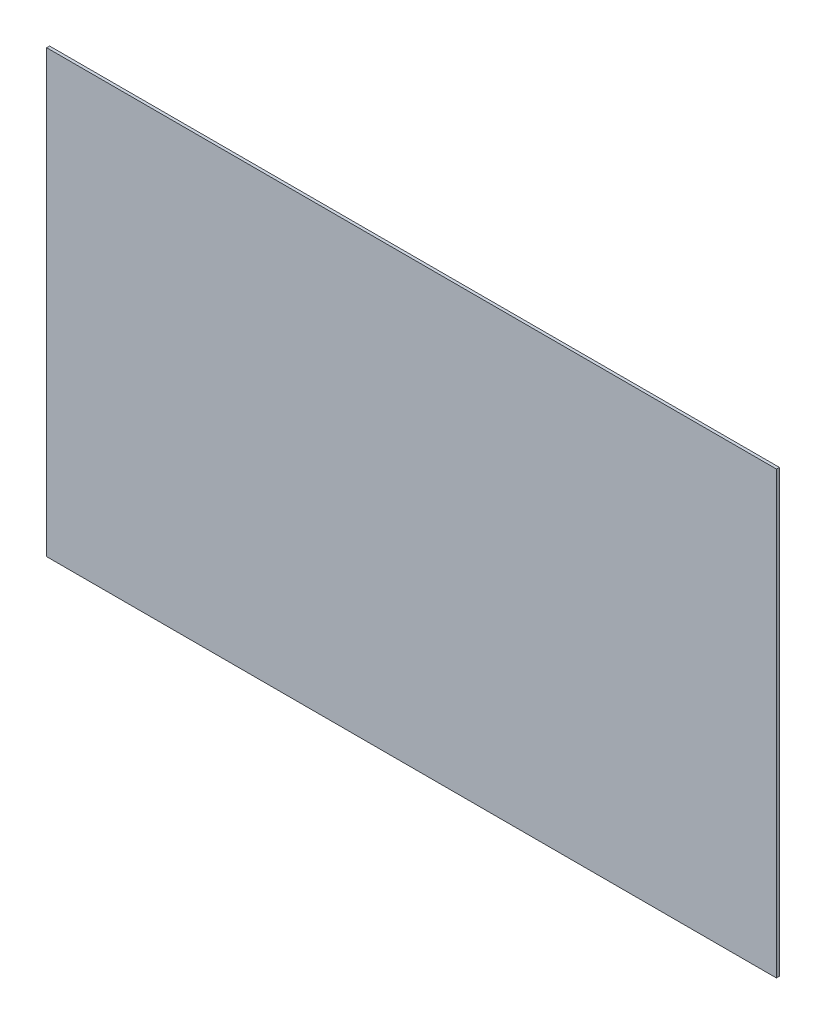
ISO-10303-21;
HEADER;
FILE_DESCRIPTION(('STEP AP214'),'2;1');
FILE_NAME('part.step','',(''),(''),'','','');
FILE_SCHEMA(('AUTOMOTIVE_DESIGN { 1 0 10303 214 1 1 1 1 }'));
ENDSEC;
DATA;
#1=APPLICATION_CONTEXT('core data for automotive mechanical design processes');
#2=APPLICATION_PROTOCOL_DEFINITION('international standard','automotive_design',2000,#1);
#3=PRODUCT_CONTEXT('',#1,'mechanical');
#4=PRODUCT('Part','Part','',(#3));
#5=PRODUCT_RELATED_PRODUCT_CATEGORY('part','',(#4));
#6=PRODUCT_DEFINITION_FORMATION('','',#4);
#7=PRODUCT_DEFINITION_CONTEXT('part definition',#1,'design');
#8=PRODUCT_DEFINITION('design','',#6,#7);
#9=PRODUCT_DEFINITION_SHAPE('','',#8);
#10=(LENGTH_UNIT() NAMED_UNIT(*) SI_UNIT(.MILLI.,.METRE.));
#11=(NAMED_UNIT(*) PLANE_ANGLE_UNIT() SI_UNIT($,.RADIAN.));
#12=(NAMED_UNIT(*) SI_UNIT($,.STERADIAN.) SOLID_ANGLE_UNIT());
#13=UNCERTAINTY_MEASURE_WITH_UNIT(LENGTH_MEASURE(1.E-05),#10,'distance_accuracy_value','');
#14=(GEOMETRIC_REPRESENTATION_CONTEXT(3) GLOBAL_UNCERTAINTY_ASSIGNED_CONTEXT((#13)) GLOBAL_UNIT_ASSIGNED_CONTEXT((#10,
#11,#12)) REPRESENTATION_CONTEXT('',''));
#15=CARTESIAN_POINT('',(0.,0.,0.));
#16=DIRECTION('',(0.,0.,1.));
#17=DIRECTION('',(1.,0.,0.));
#18=AXIS2_PLACEMENT_3D('',#15,#16,#17);
#19=CARTESIAN_POINT('',(2500.,1510.,10.));
#20=DIRECTION('',(0.,-1.,0.));
#21=DIRECTION('',(1.,0.,0.));
#22=AXIS2_PLACEMENT_3D('',#19,#20,#21);
#23=PLANE('',#22);
#24=DIRECTION('',(-1.,0.,0.));
#25=VECTOR('',#24,1.);
#26=CARTESIAN_POINT('',(2500.,1510.,0.));
#27=LINE('',#26,#25);
#28=CARTESIAN_POINT('',(2500.,1510.,0.));
#29=VERTEX_POINT('',#28);
#30=CARTESIAN_POINT('',(0.,1510.,0.));
#31=VERTEX_POINT('',#30);
#32=EDGE_CURVE('E107',#29,#31,#27,.T.);
#33=ORIENTED_EDGE('',*,*,#32,.T.);
#34=DIRECTION('',(0.,0.,-1.));
#35=VECTOR('',#34,1.);
#36=CARTESIAN_POINT('',(0.,1510.,10.));
#37=LINE('',#36,#35);
#38=CARTESIAN_POINT('',(0.,1510.,10.));
#39=VERTEX_POINT('',#38);
#40=EDGE_CURVE('E11',#39,#31,#37,.T.);
#41=ORIENTED_EDGE('',*,*,#40,.F.);
#42=DIRECTION('',(-1.,0.,0.));
#43=VECTOR('',#42,1.);
#44=CARTESIAN_POINT('',(2500.,1510.,10.));
#45=LINE('',#44,#43);
#46=CARTESIAN_POINT('',(2500.,1510.,10.));
#47=VERTEX_POINT('',#46);
#48=EDGE_CURVE('E91',#47,#39,#45,.T.);
#49=ORIENTED_EDGE('',*,*,#48,.F.);
#50=DIRECTION('',(0.,0.,-1.));
#51=VECTOR('',#50,1.);
#52=CARTESIAN_POINT('',(2500.,1510.,10.));
#53=LINE('',#52,#51);
#54=EDGE_CURVE('E103',#47,#29,#53,.T.);
#55=ORIENTED_EDGE('',*,*,#54,.T.);
#56=EDGE_LOOP('',(#33,#41,#49,#55));
#57=FACE_BOUND('',#56,.T.);
#58=ADVANCED_FACE('F39',(#57),#23,.F.);
#59=CARTESIAN_POINT('',(0.,1510.,10.));
#60=DIRECTION('',(1.,0.,0.));
#61=DIRECTION('',(0.,1.,0.));
#62=AXIS2_PLACEMENT_3D('',#59,#60,#61);
#63=PLANE('',#62);
#64=DIRECTION('',(0.,-1.,0.));
#65=VECTOR('',#64,1.);
#66=CARTESIAN_POINT('',(0.,1510.,0.));
#67=LINE('',#66,#65);
#68=CARTESIAN_POINT('',(0.,0.,0.));
#69=VERTEX_POINT('',#68);
#70=EDGE_CURVE('E96',#31,#69,#67,.T.);
#71=ORIENTED_EDGE('',*,*,#70,.T.);
#72=DIRECTION('',(0.,0.,-1.));
#73=VECTOR('',#72,1.);
#74=CARTESIAN_POINT('',(0.,0.,10.));
#75=LINE('',#74,#73);
#76=CARTESIAN_POINT('',(0.,0.,10.));
#77=VERTEX_POINT('',#76);
#78=EDGE_CURVE('E48',#77,#69,#75,.T.);
#79=ORIENTED_EDGE('',*,*,#78,.F.);
#80=DIRECTION('',(0.,-1.,0.));
#81=VECTOR('',#80,1.);
#82=CARTESIAN_POINT('',(0.,1510.,10.));
#83=LINE('',#82,#81);
#84=EDGE_CURVE('E86',#39,#77,#83,.T.);
#85=ORIENTED_EDGE('',*,*,#84,.F.);
#86=ORIENTED_EDGE('',*,*,#40,.T.);
#87=EDGE_LOOP('',(#71,#79,#85,#86));
#88=FACE_BOUND('',#87,.T.);
#89=ADVANCED_FACE('F95',(#88),#63,.F.);
#90=CARTESIAN_POINT('',(2500.,4.59242549680257E-13,10.));
#91=DIRECTION('',(0.,1.,0.));
#92=DIRECTION('',(-1.,0.,0.));
#93=AXIS2_PLACEMENT_3D('',#90,#91,#92);
#94=PLANE('',#93);
#95=DIRECTION('',(1.,0.,0.));
#96=VECTOR('',#95,1.);
#97=CARTESIAN_POINT('',(2500.,4.59242549680257E-13,0.));
#98=LINE('',#97,#96);
#99=CARTESIAN_POINT('',(2500.,4.59242549680257E-13,0.));
#100=VERTEX_POINT('',#99);
#101=EDGE_CURVE('E73',#69,#100,#98,.T.);
#102=ORIENTED_EDGE('',*,*,#101,.T.);
#103=DIRECTION('',(0.,0.,-1.));
#104=VECTOR('',#103,1.);
#105=CARTESIAN_POINT('',(2500.,4.59242549680257E-13,10.));
#106=LINE('',#105,#104);
#107=CARTESIAN_POINT('',(2500.,4.59242549680257E-13,10.));
#108=VERTEX_POINT('',#107);
#109=EDGE_CURVE('E98',#108,#100,#106,.T.);
#110=ORIENTED_EDGE('',*,*,#109,.F.);
#111=DIRECTION('',(1.,0.,0.));
#112=VECTOR('',#111,1.);
#113=CARTESIAN_POINT('',(2500.,4.59242549680257E-13,10.));
#114=LINE('',#113,#112);
#115=EDGE_CURVE('E89',#77,#108,#114,.T.);
#116=ORIENTED_EDGE('',*,*,#115,.F.);
#117=ORIENTED_EDGE('',*,*,#78,.T.);
#118=EDGE_LOOP('',(#102,#110,#116,#117));
#119=FACE_BOUND('',#118,.T.);
#120=ADVANCED_FACE('F99',(#119),#94,.F.);
#121=CARTESIAN_POINT('',(2500.,1510.,10.));
#122=DIRECTION('',(-1.,0.,0.));
#123=DIRECTION('',(0.,0.,1.));
#124=AXIS2_PLACEMENT_3D('',#121,#122,#123);
#125=PLANE('',#124);
#126=DIRECTION('',(0.,1.,0.));
#127=VECTOR('',#126,1.);
#128=CARTESIAN_POINT('',(2500.,1510.,0.));
#129=LINE('',#128,#127);
#130=EDGE_CURVE('E79',#100,#29,#129,.T.);
#131=ORIENTED_EDGE('',*,*,#130,.T.);
#132=ORIENTED_EDGE('',*,*,#54,.F.);
#133=DIRECTION('',(0.,1.,0.));
#134=VECTOR('',#133,1.);
#135=CARTESIAN_POINT('',(2500.,1510.,10.));
#136=LINE('',#135,#134);
#137=EDGE_CURVE('E56',#108,#47,#136,.T.);
#138=ORIENTED_EDGE('',*,*,#137,.F.);
#139=ORIENTED_EDGE('',*,*,#109,.T.);
#140=EDGE_LOOP('',(#131,#132,#138,#139));
#141=FACE_BOUND('',#140,.T.);
#142=ADVANCED_FACE('F120',(#141),#125,.F.);
#143=CARTESIAN_POINT('',(0.,0.,10.));
#144=DIRECTION('',(0.,0.,1.));
#145=DIRECTION('',(1.,0.,0.));
#146=AXIS2_PLACEMENT_3D('',#143,#144,#145);
#147=PLANE('',#146);
#148=ORIENTED_EDGE('',*,*,#48,.T.);
#149=ORIENTED_EDGE('',*,*,#84,.T.);
#150=ORIENTED_EDGE('',*,*,#115,.T.);
#151=ORIENTED_EDGE('',*,*,#137,.T.);
#152=EDGE_LOOP('',(#148,#149,#150,#151));
#153=FACE_BOUND('',#152,.T.);
#154=ADVANCED_FACE('F87',(#153),#147,.T.);
#155=CARTESIAN_POINT('',(0.,0.,0.));
#156=DIRECTION('',(0.,0.,1.));
#157=DIRECTION('',(1.,0.,0.));
#158=AXIS2_PLACEMENT_3D('',#155,#156,#157);
#159=PLANE('',#158);
#160=ORIENTED_EDGE('',*,*,#32,.F.);
#161=ORIENTED_EDGE('',*,*,#130,.F.);
#162=ORIENTED_EDGE('',*,*,#101,.F.);
#163=ORIENTED_EDGE('',*,*,#70,.F.);
#164=EDGE_LOOP('',(#160,#161,#162,#163));
#165=FACE_BOUND('',#164,.T.);
#166=ADVANCED_FACE('F123',(#165),#159,.F.);
#167=CLOSED_SHELL('',(#58,#89,#120,#142,#154,#166));
#168=MANIFOLD_SOLID_BREP('B2',#167);
#169=ADVANCED_BREP_SHAPE_REPRESENTATION('',(#18,#168),#14);
#170=SHAPE_DEFINITION_REPRESENTATION(#9,#169);
ENDSEC;
END-ISO-10303-21;
